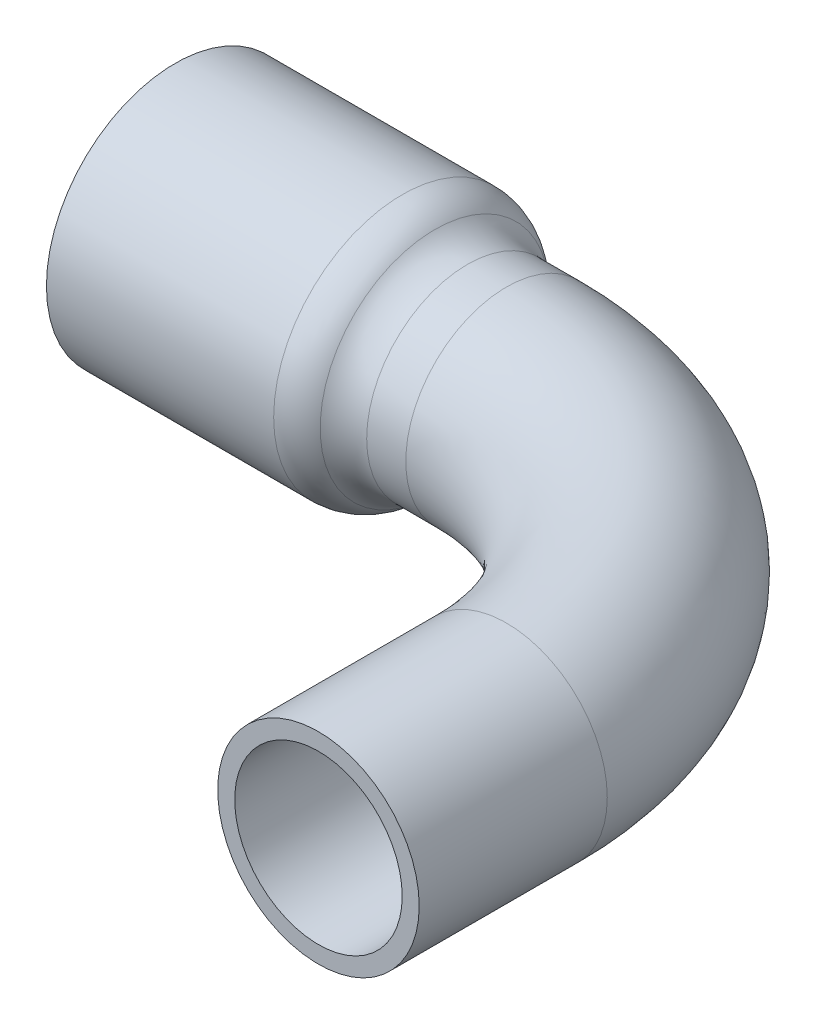
ISO-10303-21;
HEADER;
FILE_DESCRIPTION(('STEP AP214'),'2;1');
FILE_NAME('part.step','',(''),(''),'','','');
FILE_SCHEMA(('AUTOMOTIVE_DESIGN { 1 0 10303 214 1 1 1 1 }'));
ENDSEC;
DATA;
#1=APPLICATION_CONTEXT('core data for automotive mechanical design processes');
#2=APPLICATION_PROTOCOL_DEFINITION('international standard','automotive_design',2000,#1);
#3=PRODUCT_CONTEXT('',#1,'mechanical');
#4=PRODUCT('Part','Part','',(#3));
#5=PRODUCT_RELATED_PRODUCT_CATEGORY('part','',(#4));
#6=PRODUCT_DEFINITION_FORMATION('','',#4);
#7=PRODUCT_DEFINITION_CONTEXT('part definition',#1,'design');
#8=PRODUCT_DEFINITION('design','',#6,#7);
#9=PRODUCT_DEFINITION_SHAPE('','',#8);
#10=(LENGTH_UNIT() NAMED_UNIT(*) SI_UNIT(.MILLI.,.METRE.));
#11=(NAMED_UNIT(*) PLANE_ANGLE_UNIT() SI_UNIT($,.RADIAN.));
#12=(NAMED_UNIT(*) SI_UNIT($,.STERADIAN.) SOLID_ANGLE_UNIT());
#13=UNCERTAINTY_MEASURE_WITH_UNIT(LENGTH_MEASURE(1.E-05),#10,'distance_accuracy_value','');
#14=(GEOMETRIC_REPRESENTATION_CONTEXT(3) GLOBAL_UNCERTAINTY_ASSIGNED_CONTEXT((#13)) GLOBAL_UNIT_ASSIGNED_CONTEXT((#10,
#11,#12)) REPRESENTATION_CONTEXT('',''));
#15=CARTESIAN_POINT('',(0.,0.,0.));
#16=DIRECTION('',(0.,0.,1.));
#17=DIRECTION('',(1.,0.,0.));
#18=AXIS2_PLACEMENT_3D('',#15,#16,#17);
#19=CARTESIAN_POINT('',(0.,0.,10.668));
#20=DIRECTION('',(0.,0.,-1.));
#21=DIRECTION('',(-1.,0.,0.));
#22=AXIS2_PLACEMENT_3D('',#19,#20,#21);
#23=CYLINDRICAL_SURFACE('',#22,5.715);
#24=CARTESIAN_POINT('',(0.,0.,10.668));
#25=DIRECTION('',(0.,0.,1.));
#26=DIRECTION('',(1.,0.,0.));
#27=AXIS2_PLACEMENT_3D('',#24,#25,#26);
#28=CIRCLE('',#27,5.715);
#29=CARTESIAN_POINT('',(5.715,0.,10.668));
#30=VERTEX_POINT('',#29);
#31=EDGE_CURVE('E59',#30,#30,#28,.T.);
#32=ORIENTED_EDGE('',*,*,#31,.F.);
#33=EDGE_LOOP('',(#32));
#34=FACE_BOUND('',#33,.T.);
#35=CARTESIAN_POINT('',(0.,0.,0.));
#36=DIRECTION('',(0.,0.,1.));
#37=DIRECTION('',(1.,0.,0.));
#38=AXIS2_PLACEMENT_3D('',#35,#36,#37);
#39=CIRCLE('',#38,5.715);
#40=CARTESIAN_POINT('',(5.715,0.,0.));
#41=VERTEX_POINT('',#40);
#42=EDGE_CURVE('E62',#41,#41,#39,.T.);
#43=ORIENTED_EDGE('',*,*,#42,.T.);
#44=EDGE_LOOP('',(#43));
#45=FACE_BOUND('',#44,.T.);
#46=ADVANCED_FACE('F44',(#34,#45),#23,.T.);
#47=CARTESIAN_POINT('',(0.,0.,10.668));
#48=DIRECTION('',(0.,0.,1.));
#49=DIRECTION('',(1.,0.,0.));
#50=AXIS2_PLACEMENT_3D('',#47,#48,#49);
#51=PLANE('',#50);
#52=CARTESIAN_POINT('',(0.,0.,10.668));
#53=DIRECTION('',(0.,0.,1.));
#54=DIRECTION('',(1.,0.,0.));
#55=AXIS2_PLACEMENT_3D('',#52,#53,#54);
#56=CIRCLE('',#55,4.7498);
#57=CARTESIAN_POINT('',(4.7498,0.,10.668));
#58=VERTEX_POINT('',#57);
#59=EDGE_CURVE('E74',#58,#58,#56,.T.);
#60=ORIENTED_EDGE('',*,*,#59,.F.);
#61=EDGE_LOOP('',(#60));
#62=FACE_BOUND('',#61,.T.);
#63=ORIENTED_EDGE('',*,*,#31,.T.);
#64=EDGE_LOOP('',(#63));
#65=FACE_BOUND('',#64,.T.);
#66=ADVANCED_FACE('F113',(#62,#65),#51,.T.);
#67=CARTESIAN_POINT('',(-16.51,0.,0.));
#68=DIRECTION('',(0.,1.,0.));
#69=DIRECTION('',(0.,0.,1.));
#70=AXIS2_PLACEMENT_3D('',#67,#68,#69);
#71=TOROIDAL_SURFACE('',#70,16.51,5.715);
#72=CARTESIAN_POINT('',(-16.51,0.,-16.51));
#73=DIRECTION('',(-1.,0.,0.));
#74=DIRECTION('',(0.,0.,1.));
#75=AXIS2_PLACEMENT_3D('',#72,#73,#74);
#76=CIRCLE('',#75,5.715);
#77=CARTESIAN_POINT('',(-16.51,0.,-22.225));
#78=VERTEX_POINT('',#77);
#79=EDGE_CURVE('E65',#78,#78,#76,.T.);
#80=CARTESIAN_POINT('',(-16.51,0.,0.));
#81=DIRECTION('',(0.,1.,0.));
#82=DIRECTION('',(0.,0.,1.));
#83=AXIS2_PLACEMENT_3D('',#80,#81,#82);
#84=CIRCLE('',#83,22.225);
#85=EDGE_CURVE('',#41,#78,#84,.T.);
#86=ORIENTED_EDGE('',*,*,#42,.F.);
#87=ORIENTED_EDGE('',*,*,#79,.F.);
#88=ORIENTED_EDGE('',*,*,#85,.T.);
#89=ORIENTED_EDGE('',*,*,#85,.F.);
#90=EDGE_LOOP('',(#86,#88,#87,#89));
#91=FACE_BOUND('',#90,.T.);
#92=ADVANCED_FACE('F109',(#91),#71,.T.);
#93=CARTESIAN_POINT('',(-21.082,0.,-16.51));
#94=DIRECTION('',(1.,0.,0.));
#95=DIRECTION('',(0.,0.,-1.));
#96=AXIS2_PLACEMENT_3D('',#93,#94,#95);
#97=CYLINDRICAL_SURFACE('',#96,5.715);
#98=CARTESIAN_POINT('',(-18.7273569803471,0.,-16.51));
#99=DIRECTION('',(-1.,0.,0.));
#100=DIRECTION('',(0.,0.,1.));
#101=AXIS2_PLACEMENT_3D('',#98,#99,#100);
#102=CIRCLE('',#101,5.715);
#103=CARTESIAN_POINT('',(-18.7273569803471,0.,-10.795));
#104=VERTEX_POINT('',#103);
#105=EDGE_CURVE('E55',#104,#104,#102,.F.);
#106=ORIENTED_EDGE('',*,*,#105,.T.);
#107=EDGE_LOOP('',(#106));
#108=FACE_BOUND('',#107,.T.);
#109=ORIENTED_EDGE('',*,*,#79,.T.);
#110=EDGE_LOOP('',(#109));
#111=FACE_BOUND('',#110,.T.);
#112=ADVANCED_FACE('F104',(#108,#111),#97,.T.);
#113=CARTESIAN_POINT('',(-35.306,0.,-16.51));
#114=DIRECTION('',(1.,0.,0.));
#115=DIRECTION('',(0.,0.,-1.));
#116=AXIS2_PLACEMENT_3D('',#113,#114,#115);
#117=CYLINDRICAL_SURFACE('',#116,7.3025);
#118=CARTESIAN_POINT('',(-22.4163736176097,0.,-16.51));
#119=DIRECTION('',(1.,0.,0.));
#120=DIRECTION('',(0.,0.,-1.));
#121=AXIS2_PLACEMENT_3D('',#118,#119,#120);
#122=CIRCLE('',#121,7.3025);
#123=CARTESIAN_POINT('',(-22.4163736176097,0.,-23.8125));
#124=VERTEX_POINT('',#123);
#125=EDGE_CURVE('E51',#124,#124,#122,.F.);
#126=ORIENTED_EDGE('',*,*,#125,.T.);
#127=EDGE_LOOP('',(#126));
#128=FACE_BOUND('',#127,.T.);
#129=CARTESIAN_POINT('',(-35.306,0.,-16.51));
#130=DIRECTION('',(-1.,0.,0.));
#131=DIRECTION('',(0.,0.,1.));
#132=AXIS2_PLACEMENT_3D('',#129,#130,#131);
#133=CIRCLE('',#132,7.3025);
#134=CARTESIAN_POINT('',(-35.306,0.,-9.20750000000001));
#135=VERTEX_POINT('',#134);
#136=EDGE_CURVE('E70',#135,#135,#133,.T.);
#137=ORIENTED_EDGE('',*,*,#136,.F.);
#138=EDGE_LOOP('',(#137));
#139=FACE_BOUND('',#138,.T.);
#140=ADVANCED_FACE('F99',(#128,#139),#117,.T.);
#141=CARTESIAN_POINT('',(-35.306,0.,0.));
#142=DIRECTION('',(-1.,0.,0.));
#143=DIRECTION('',(0.,0.,1.));
#144=AXIS2_PLACEMENT_3D('',#141,#142,#143);
#145=PLANE('',#144);
#146=CARTESIAN_POINT('',(-35.306,0.,-16.51));
#147=DIRECTION('',(-1.,0.,0.));
#148=DIRECTION('',(0.,0.,1.));
#149=AXIS2_PLACEMENT_3D('',#146,#147,#148);
#150=CIRCLE('',#149,6.35);
#151=CARTESIAN_POINT('',(-35.306,0.,-10.16));
#152=VERTEX_POINT('',#151);
#153=EDGE_CURVE('E80',#152,#152,#150,.T.);
#154=ORIENTED_EDGE('',*,*,#153,.F.);
#155=EDGE_LOOP('',(#154));
#156=FACE_BOUND('',#155,.T.);
#157=ORIENTED_EDGE('',*,*,#136,.T.);
#158=EDGE_LOOP('',(#157));
#159=FACE_BOUND('',#158,.T.);
#160=ADVANCED_FACE('F95',(#156,#159),#145,.T.);
#161=CARTESIAN_POINT('',(-18.7273569803471,0.,-16.51));
#162=DIRECTION('',(-1.,0.,0.));
#163=DIRECTION('',(0.,0.,1.));
#164=AXIS2_PLACEMENT_3D('',#161,#162,#163);
#165=TOROIDAL_SURFACE('',#164,8.255,2.54);
#166=CARTESIAN_POINT('',(-20.5718652989784,0.,-16.51));
#167=DIRECTION('',(1.,0.,0.));
#168=DIRECTION('',(0.,0.,-1.));
#169=AXIS2_PLACEMENT_3D('',#166,#167,#168);
#170=CIRCLE('',#169,6.50875);
#171=CARTESIAN_POINT('',(-20.5718652989784,0.,-23.01875));
#172=VERTEX_POINT('',#171);
#173=EDGE_CURVE('E11',#172,#172,#170,.T.);
#174=ORIENTED_EDGE('',*,*,#173,.T.);
#175=EDGE_LOOP('',(#174));
#176=FACE_BOUND('',#175,.T.);
#177=ORIENTED_EDGE('',*,*,#105,.F.);
#178=EDGE_LOOP('',(#177));
#179=FACE_BOUND('',#178,.T.);
#180=ADVANCED_FACE('F98',(#176,#179),#165,.F.);
#181=CARTESIAN_POINT('',(-22.4163736176097,0.,-16.51));
#182=DIRECTION('',(1.,0.,0.));
#183=DIRECTION('',(0.,0.,-1.));
#184=AXIS2_PLACEMENT_3D('',#181,#182,#183);
#185=TOROIDAL_SURFACE('',#184,4.7625,2.54);
#186=ORIENTED_EDGE('',*,*,#173,.F.);
#187=EDGE_LOOP('',(#186));
#188=FACE_BOUND('',#187,.T.);
#189=ORIENTED_EDGE('',*,*,#125,.F.);
#190=EDGE_LOOP('',(#189));
#191=FACE_BOUND('',#190,.T.);
#192=ADVANCED_FACE('F46',(#188,#191),#185,.T.);
#193=CARTESIAN_POINT('',(0.,0.,0.));
#194=DIRECTION('',(0.,0.,1.));
#195=DIRECTION('',(1.,0.,0.));
#196=AXIS2_PLACEMENT_3D('',#193,#194,#195);
#197=CYLINDRICAL_SURFACE('',#196,4.7498);
#198=CARTESIAN_POINT('',(0.,0.,0.));
#199=DIRECTION('',(0.,0.,1.));
#200=DIRECTION('',(1.,0.,0.));
#201=AXIS2_PLACEMENT_3D('',#198,#199,#200);
#202=CIRCLE('',#201,4.7498);
#203=CARTESIAN_POINT('',(4.7498,0.,0.));
#204=VERTEX_POINT('',#203);
#205=EDGE_CURVE('E73',#204,#204,#202,.T.);
#206=ORIENTED_EDGE('',*,*,#205,.F.);
#207=EDGE_LOOP('',(#206));
#208=FACE_BOUND('',#207,.T.);
#209=ORIENTED_EDGE('',*,*,#59,.T.);
#210=EDGE_LOOP('',(#209));
#211=FACE_BOUND('',#210,.T.);
#212=ADVANCED_FACE('F128',(#208,#211),#197,.F.);
#213=CARTESIAN_POINT('',(0.,0.,0.));
#214=DIRECTION('',(0.,0.,1.));
#215=DIRECTION('',(1.,0.,0.));
#216=AXIS2_PLACEMENT_3D('',#213,#214,#215);
#217=PLANE('',#216);
#218=ORIENTED_EDGE('',*,*,#205,.T.);
#219=EDGE_LOOP('',(#218));
#220=FACE_BOUND('',#219,.T.);
#221=ADVANCED_FACE('F91',(#220),#217,.T.);
#222=CARTESIAN_POINT('',(-24.638,0.,-16.51));
#223=DIRECTION('',(-1.,0.,0.));
#224=DIRECTION('',(0.,0.,1.));
#225=AXIS2_PLACEMENT_3D('',#222,#223,#224);
#226=CYLINDRICAL_SURFACE('',#225,6.35);
#227=CARTESIAN_POINT('',(-24.638,0.,-16.51));
#228=DIRECTION('',(-1.,0.,0.));
#229=DIRECTION('',(0.,0.,1.));
#230=AXIS2_PLACEMENT_3D('',#227,#228,#229);
#231=CIRCLE('',#230,6.35);
#232=CARTESIAN_POINT('',(-24.638,0.,-10.16));
#233=VERTEX_POINT('',#232);
#234=EDGE_CURVE('E77',#233,#233,#231,.T.);
#235=ORIENTED_EDGE('',*,*,#234,.F.);
#236=EDGE_LOOP('',(#235));
#237=FACE_BOUND('',#236,.T.);
#238=ORIENTED_EDGE('',*,*,#153,.T.);
#239=EDGE_LOOP('',(#238));
#240=FACE_BOUND('',#239,.T.);
#241=ADVANCED_FACE('F88',(#237,#240),#226,.F.);
#242=CARTESIAN_POINT('',(-24.638,0.,0.));
#243=DIRECTION('',(-1.,0.,0.));
#244=DIRECTION('',(0.,0.,1.));
#245=AXIS2_PLACEMENT_3D('',#242,#243,#244);
#246=PLANE('',#245);
#247=ORIENTED_EDGE('',*,*,#234,.T.);
#248=EDGE_LOOP('',(#247));
#249=FACE_BOUND('',#248,.T.);
#250=ADVANCED_FACE('F86',(#249),#246,.T.);
#251=CLOSED_SHELL('',(#46,#66,#92,#112,#140,#160,#180,#192,#212,#221,#241,#250));
#252=MANIFOLD_SOLID_BREP('B2',#251);
#253=ADVANCED_BREP_SHAPE_REPRESENTATION('',(#18,#252),#14);
#254=SHAPE_DEFINITION_REPRESENTATION(#9,#253);
ENDSEC;
END-ISO-10303-21;
